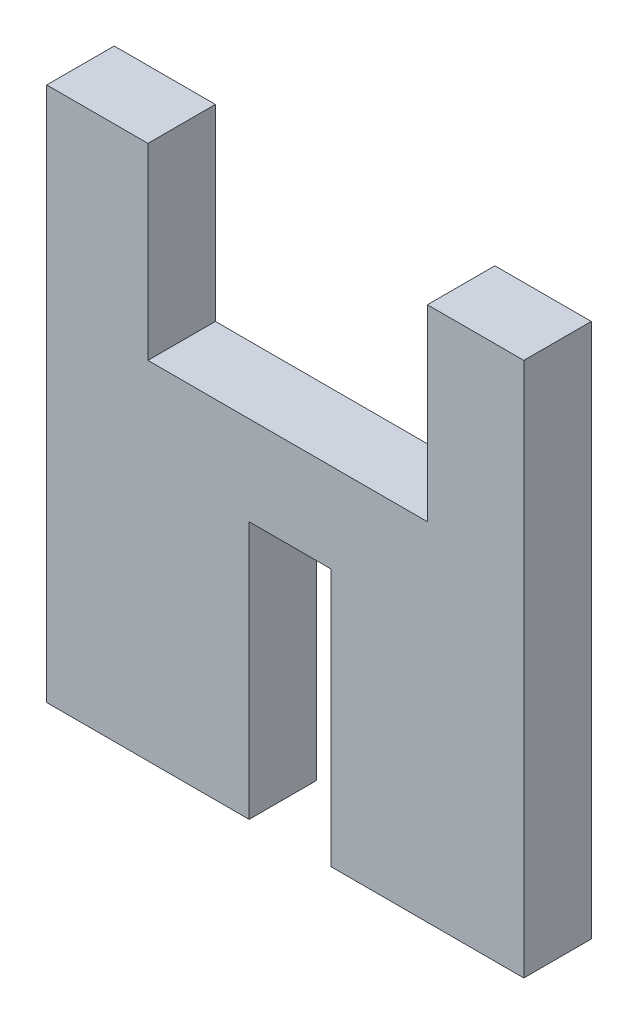
ISO-10303-21;
HEADER;
FILE_DESCRIPTION(('STEP AP214'),'2;1');
FILE_NAME('part.step','',(''),(''),'','','');
FILE_SCHEMA(('AUTOMOTIVE_DESIGN { 1 0 10303 214 1 1 1 1 }'));
ENDSEC;
DATA;
#1=APPLICATION_CONTEXT('core data for automotive mechanical design processes');
#2=APPLICATION_PROTOCOL_DEFINITION('international standard','automotive_design',2000,#1);
#3=PRODUCT_CONTEXT('',#1,'mechanical');
#4=PRODUCT('Part','Part','',(#3));
#5=PRODUCT_RELATED_PRODUCT_CATEGORY('part','',(#4));
#6=PRODUCT_DEFINITION_FORMATION('','',#4);
#7=PRODUCT_DEFINITION_CONTEXT('part definition',#1,'design');
#8=PRODUCT_DEFINITION('design','',#6,#7);
#9=PRODUCT_DEFINITION_SHAPE('','',#8);
#10=(LENGTH_UNIT() NAMED_UNIT(*) SI_UNIT(.MILLI.,.METRE.));
#11=(NAMED_UNIT(*) PLANE_ANGLE_UNIT() SI_UNIT($,.RADIAN.));
#12=(NAMED_UNIT(*) SI_UNIT($,.STERADIAN.) SOLID_ANGLE_UNIT());
#13=UNCERTAINTY_MEASURE_WITH_UNIT(LENGTH_MEASURE(1.E-05),#10,'distance_accuracy_value','');
#14=(GEOMETRIC_REPRESENTATION_CONTEXT(3) GLOBAL_UNCERTAINTY_ASSIGNED_CONTEXT((#13)) GLOBAL_UNIT_ASSIGNED_CONTEXT((#10,
#11,#12)) REPRESENTATION_CONTEXT('',''));
#15=CARTESIAN_POINT('',(0.,0.,0.));
#16=DIRECTION('',(0.,0.,1.));
#17=DIRECTION('',(1.,0.,0.));
#18=AXIS2_PLACEMENT_3D('',#15,#16,#17);
#19=CARTESIAN_POINT('',(-9.22857142857145,13.9642857142857,3.39999999999999));
#20=DIRECTION('',(0.,-1.,0.));
#21=DIRECTION('',(0.,0.,-1.));
#22=AXIS2_PLACEMENT_3D('',#19,#20,#21);
#23=PLANE('',#22);
#24=DIRECTION('',(-1.,0.,0.));
#25=VECTOR('',#24,1.);
#26=CARTESIAN_POINT('',(-9.22857142857145,13.9642857142857,0.));
#27=LINE('',#26,#25);
#28=CARTESIAN_POINT('',(-9.22857142857145,13.9642857142857,0.));
#29=VERTEX_POINT('',#28);
#30=CARTESIAN_POINT('',(-14.3285714285714,13.9642857142857,0.));
#31=VERTEX_POINT('',#30);
#32=EDGE_CURVE('E157',#29,#31,#27,.T.);
#33=ORIENTED_EDGE('',*,*,#32,.T.);
#34=DIRECTION('',(0.,0.,-1.));
#35=VECTOR('',#34,1.);
#36=CARTESIAN_POINT('',(-14.3285714285714,13.9642857142857,3.39999999999999));
#37=LINE('',#36,#35);
#38=CARTESIAN_POINT('',(-14.3285714285714,13.9642857142857,3.39999999999999));
#39=VERTEX_POINT('',#38);
#40=EDGE_CURVE('E11',#39,#31,#37,.T.);
#41=ORIENTED_EDGE('',*,*,#40,.F.);
#42=DIRECTION('',(-1.,0.,0.));
#43=VECTOR('',#42,1.);
#44=CARTESIAN_POINT('',(-9.22857142857145,13.9642857142857,3.39999999999999));
#45=LINE('',#44,#43);
#46=CARTESIAN_POINT('',(-9.22857142857145,13.9642857142857,3.39999999999999));
#47=VERTEX_POINT('',#46);
#48=EDGE_CURVE('E179',#47,#39,#45,.T.);
#49=ORIENTED_EDGE('',*,*,#48,.F.);
#50=DIRECTION('',(0.,0.,-1.));
#51=VECTOR('',#50,1.);
#52=CARTESIAN_POINT('',(-9.22857142857145,13.9642857142857,3.39999999999999));
#53=LINE('',#52,#51);
#54=EDGE_CURVE('E153',#47,#29,#53,.T.);
#55=ORIENTED_EDGE('',*,*,#54,.T.);
#56=EDGE_LOOP('',(#33,#41,#49,#55));
#57=FACE_BOUND('',#56,.T.);
#58=ADVANCED_FACE('F37',(#57),#23,.F.);
#59=CARTESIAN_POINT('',(-14.3285714285714,13.9642857142857,3.39999999999999));
#60=DIRECTION('',(1.,0.,0.));
#61=DIRECTION('',(0.,0.,-1.));
#62=AXIS2_PLACEMENT_3D('',#59,#60,#61);
#63=PLANE('',#62);
#64=DIRECTION('',(0.,-1.,0.));
#65=VECTOR('',#64,1.);
#66=CARTESIAN_POINT('',(-14.3285714285714,13.9642857142857,0.));
#67=LINE('',#66,#65);
#68=CARTESIAN_POINT('',(-14.3285714285714,-12.9928571428571,0.));
#69=VERTEX_POINT('',#68);
#70=EDGE_CURVE('E160',#31,#69,#67,.T.);
#71=ORIENTED_EDGE('',*,*,#70,.T.);
#72=DIRECTION('',(0.,0.,-1.));
#73=VECTOR('',#72,1.);
#74=CARTESIAN_POINT('',(-14.3285714285714,-12.9928571428571,3.39999999999999));
#75=LINE('',#74,#73);
#76=CARTESIAN_POINT('',(-14.3285714285714,-12.9928571428571,3.39999999999999));
#77=VERTEX_POINT('',#76);
#78=EDGE_CURVE('E45',#77,#69,#75,.T.);
#79=ORIENTED_EDGE('',*,*,#78,.F.);
#80=DIRECTION('',(0.,-1.,0.));
#81=VECTOR('',#80,1.);
#82=CARTESIAN_POINT('',(-14.3285714285714,13.9642857142857,3.39999999999999));
#83=LINE('',#82,#81);
#84=EDGE_CURVE('E108',#39,#77,#83,.T.);
#85=ORIENTED_EDGE('',*,*,#84,.F.);
#86=ORIENTED_EDGE('',*,*,#40,.T.);
#87=EDGE_LOOP('',(#71,#79,#85,#86));
#88=FACE_BOUND('',#87,.T.);
#89=ADVANCED_FACE('F257',(#88),#63,.F.);
#90=CARTESIAN_POINT('',(-14.3285714285714,-12.9928571428571,3.39999999999999));
#91=DIRECTION('',(0.,1.,0.));
#92=DIRECTION('',(0.,0.,1.));
#93=AXIS2_PLACEMENT_3D('',#90,#91,#92);
#94=PLANE('',#93);
#95=DIRECTION('',(1.,0.,0.));
#96=VECTOR('',#95,1.);
#97=CARTESIAN_POINT('',(-14.3285714285714,-12.9928571428571,0.));
#98=LINE('',#97,#96);
#99=CARTESIAN_POINT('',(-4.12857142857145,-12.9928571428571,0.));
#100=VERTEX_POINT('',#99);
#101=EDGE_CURVE('E162',#69,#100,#98,.T.);
#102=ORIENTED_EDGE('',*,*,#101,.T.);
#103=DIRECTION('',(0.,0.,-1.));
#104=VECTOR('',#103,1.);
#105=CARTESIAN_POINT('',(-4.12857142857145,-12.9928571428571,3.39999999999999));
#106=LINE('',#105,#104);
#107=CARTESIAN_POINT('',(-4.12857142857145,-12.9928571428571,3.39999999999999));
#108=VERTEX_POINT('',#107);
#109=EDGE_CURVE('E198',#108,#100,#106,.T.);
#110=ORIENTED_EDGE('',*,*,#109,.F.);
#111=DIRECTION('',(1.,0.,0.));
#112=VECTOR('',#111,1.);
#113=CARTESIAN_POINT('',(-14.3285714285714,-12.9928571428571,3.39999999999999));
#114=LINE('',#113,#112);
#115=EDGE_CURVE('E206',#77,#108,#114,.T.);
#116=ORIENTED_EDGE('',*,*,#115,.F.);
#117=ORIENTED_EDGE('',*,*,#78,.T.);
#118=EDGE_LOOP('',(#102,#110,#116,#117));
#119=FACE_BOUND('',#118,.T.);
#120=ADVANCED_FACE('F204',(#119),#94,.F.);
#121=CARTESIAN_POINT('',(-4.12857142857145,-12.9928571428571,3.39999999999999));
#122=DIRECTION('',(-1.,0.,0.));
#123=DIRECTION('',(0.,0.,1.));
#124=AXIS2_PLACEMENT_3D('',#121,#122,#123);
#125=PLANE('',#124);
#126=DIRECTION('',(0.,1.,0.));
#127=VECTOR('',#126,1.);
#128=CARTESIAN_POINT('',(-4.12857142857145,-12.9928571428571,0.));
#129=LINE('',#128,#127);
#130=CARTESIAN_POINT('',(-4.12857142857145,0.,0.));
#131=VERTEX_POINT('',#130);
#132=EDGE_CURVE('E164',#100,#131,#129,.T.);
#133=ORIENTED_EDGE('',*,*,#132,.T.);
#134=DIRECTION('',(0.,0.,-1.));
#135=VECTOR('',#134,1.);
#136=CARTESIAN_POINT('',(-4.12857142857145,0.,3.39999999999999));
#137=LINE('',#136,#135);
#138=CARTESIAN_POINT('',(-4.12857142857145,0.,3.39999999999999));
#139=VERTEX_POINT('',#138);
#140=EDGE_CURVE('E195',#139,#131,#137,.T.);
#141=ORIENTED_EDGE('',*,*,#140,.F.);
#142=DIRECTION('',(0.,1.,0.));
#143=VECTOR('',#142,1.);
#144=CARTESIAN_POINT('',(-4.12857142857145,-12.9928571428571,3.39999999999999));
#145=LINE('',#144,#143);
#146=EDGE_CURVE('E224',#108,#139,#145,.T.);
#147=ORIENTED_EDGE('',*,*,#146,.F.);
#148=ORIENTED_EDGE('',*,*,#109,.T.);
#149=EDGE_LOOP('',(#133,#141,#147,#148));
#150=FACE_BOUND('',#149,.T.);
#151=ADVANCED_FACE('F215',(#150),#125,.F.);
#152=CARTESIAN_POINT('',(-4.12857142857145,0.,3.39999999999999));
#153=DIRECTION('',(0.,1.,0.));
#154=DIRECTION('',(0.,0.,1.));
#155=AXIS2_PLACEMENT_3D('',#152,#153,#154);
#156=PLANE('',#155);
#157=DIRECTION('',(1.,0.,0.));
#158=VECTOR('',#157,1.);
#159=CARTESIAN_POINT('',(-4.12857142857145,0.,0.));
#160=LINE('',#159,#158);
#161=CARTESIAN_POINT('',(0.,0.,0.));
#162=VERTEX_POINT('',#161);
#163=EDGE_CURVE('E166',#131,#162,#160,.T.);
#164=ORIENTED_EDGE('',*,*,#163,.T.);
#165=DIRECTION('',(0.,0.,-1.));
#166=VECTOR('',#165,1.);
#167=CARTESIAN_POINT('',(0.,0.,3.39999999999999));
#168=LINE('',#167,#166);
#169=CARTESIAN_POINT('',(0.,0.,3.39999999999999));
#170=VERTEX_POINT('',#169);
#171=EDGE_CURVE('E192',#170,#162,#168,.T.);
#172=ORIENTED_EDGE('',*,*,#171,.F.);
#173=DIRECTION('',(1.,0.,0.));
#174=VECTOR('',#173,1.);
#175=CARTESIAN_POINT('',(-4.12857142857145,0.,3.39999999999999));
#176=LINE('',#175,#174);
#177=EDGE_CURVE('E221',#139,#170,#176,.T.);
#178=ORIENTED_EDGE('',*,*,#177,.F.);
#179=ORIENTED_EDGE('',*,*,#140,.T.);
#180=EDGE_LOOP('',(#164,#172,#178,#179));
#181=FACE_BOUND('',#180,.T.);
#182=ADVANCED_FACE('F219',(#181),#156,.F.);
#183=CARTESIAN_POINT('',(0.,0.,3.39999999999999));
#184=DIRECTION('',(1.,0.,0.));
#185=DIRECTION('',(0.,0.,-1.));
#186=AXIS2_PLACEMENT_3D('',#183,#184,#185);
#187=PLANE('',#186);
#188=DIRECTION('',(0.,-1.,0.));
#189=VECTOR('',#188,1.);
#190=CARTESIAN_POINT('',(0.,0.,0.));
#191=LINE('',#190,#189);
#192=CARTESIAN_POINT('',(0.,-12.9928571428571,0.));
#193=VERTEX_POINT('',#192);
#194=EDGE_CURVE('E168',#162,#193,#191,.T.);
#195=ORIENTED_EDGE('',*,*,#194,.T.);
#196=DIRECTION('',(0.,0.,-1.));
#197=VECTOR('',#196,1.);
#198=CARTESIAN_POINT('',(0.,-12.9928571428571,3.39999999999999));
#199=LINE('',#198,#197);
#200=CARTESIAN_POINT('',(0.,-12.9928571428571,3.39999999999999));
#201=VERTEX_POINT('',#200);
#202=EDGE_CURVE('E189',#201,#193,#199,.T.);
#203=ORIENTED_EDGE('',*,*,#202,.F.);
#204=DIRECTION('',(0.,-1.,0.));
#205=VECTOR('',#204,1.);
#206=CARTESIAN_POINT('',(0.,0.,3.39999999999999));
#207=LINE('',#206,#205);
#208=EDGE_CURVE('E223',#170,#201,#207,.T.);
#209=ORIENTED_EDGE('',*,*,#208,.F.);
#210=ORIENTED_EDGE('',*,*,#171,.T.);
#211=EDGE_LOOP('',(#195,#203,#209,#210));
#212=FACE_BOUND('',#211,.T.);
#213=ADVANCED_FACE('F270',(#212),#187,.F.);
#214=CARTESIAN_POINT('',(0.,-12.9928571428571,3.39999999999999));
#215=DIRECTION('',(0.,1.,0.));
#216=DIRECTION('',(0.,0.,1.));
#217=AXIS2_PLACEMENT_3D('',#214,#215,#216);
#218=PLANE('',#217);
#219=DIRECTION('',(1.,0.,0.));
#220=VECTOR('',#219,1.);
#221=CARTESIAN_POINT('',(0.,-12.9928571428571,0.));
#222=LINE('',#221,#220);
#223=CARTESIAN_POINT('',(9.7142857142857,-12.9928571428571,0.));
#224=VERTEX_POINT('',#223);
#225=EDGE_CURVE('E170',#193,#224,#222,.T.);
#226=ORIENTED_EDGE('',*,*,#225,.T.);
#227=DIRECTION('',(0.,0.,-1.));
#228=VECTOR('',#227,1.);
#229=CARTESIAN_POINT('',(9.7142857142857,-12.9928571428571,3.39999999999999));
#230=LINE('',#229,#228);
#231=CARTESIAN_POINT('',(9.7142857142857,-12.9928571428571,3.39999999999999));
#232=VERTEX_POINT('',#231);
#233=EDGE_CURVE('E186',#232,#224,#230,.T.);
#234=ORIENTED_EDGE('',*,*,#233,.F.);
#235=DIRECTION('',(1.,0.,0.));
#236=VECTOR('',#235,1.);
#237=CARTESIAN_POINT('',(0.,-12.9928571428571,3.39999999999999));
#238=LINE('',#237,#236);
#239=EDGE_CURVE('E226',#201,#232,#238,.T.);
#240=ORIENTED_EDGE('',*,*,#239,.F.);
#241=ORIENTED_EDGE('',*,*,#202,.T.);
#242=EDGE_LOOP('',(#226,#234,#240,#241));
#243=FACE_BOUND('',#242,.T.);
#244=ADVANCED_FACE('F273',(#243),#218,.F.);
#245=CARTESIAN_POINT('',(9.7142857142857,-12.9928571428571,3.39999999999999));
#246=DIRECTION('',(-1.,0.,0.));
#247=DIRECTION('',(0.,0.,1.));
#248=AXIS2_PLACEMENT_3D('',#245,#246,#247);
#249=PLANE('',#248);
#250=DIRECTION('',(0.,1.,0.));
#251=VECTOR('',#250,1.);
#252=CARTESIAN_POINT('',(9.7142857142857,-12.9928571428571,0.));
#253=LINE('',#252,#251);
#254=CARTESIAN_POINT('',(9.7142857142857,13.9642857142857,0.));
#255=VERTEX_POINT('',#254);
#256=EDGE_CURVE('E172',#224,#255,#253,.T.);
#257=ORIENTED_EDGE('',*,*,#256,.T.);
#258=DIRECTION('',(0.,0.,-1.));
#259=VECTOR('',#258,1.);
#260=CARTESIAN_POINT('',(9.7142857142857,13.9642857142857,3.39999999999999));
#261=LINE('',#260,#259);
#262=CARTESIAN_POINT('',(9.7142857142857,13.9642857142857,3.39999999999999));
#263=VERTEX_POINT('',#262);
#264=EDGE_CURVE('E183',#263,#255,#261,.T.);
#265=ORIENTED_EDGE('',*,*,#264,.F.);
#266=DIRECTION('',(0.,1.,0.));
#267=VECTOR('',#266,1.);
#268=CARTESIAN_POINT('',(9.7142857142857,-12.9928571428571,3.39999999999999));
#269=LINE('',#268,#267);
#270=EDGE_CURVE('E232',#232,#263,#269,.T.);
#271=ORIENTED_EDGE('',*,*,#270,.F.);
#272=ORIENTED_EDGE('',*,*,#233,.T.);
#273=EDGE_LOOP('',(#257,#265,#271,#272));
#274=FACE_BOUND('',#273,.T.);
#275=ADVANCED_FACE('F238',(#274),#249,.F.);
#276=CARTESIAN_POINT('',(9.7142857142857,13.9642857142857,3.39999999999999));
#277=DIRECTION('',(0.,-1.,0.));
#278=DIRECTION('',(0.,0.,-1.));
#279=AXIS2_PLACEMENT_3D('',#276,#277,#278);
#280=PLANE('',#279);
#281=DIRECTION('',(-1.,0.,0.));
#282=VECTOR('',#281,1.);
#283=CARTESIAN_POINT('',(9.7142857142857,13.9642857142857,0.));
#284=LINE('',#283,#282);
#285=CARTESIAN_POINT('',(4.85714285713357,13.9642857142857,0.));
#286=VERTEX_POINT('',#285);
#287=EDGE_CURVE('E174',#255,#286,#284,.T.);
#288=ORIENTED_EDGE('',*,*,#287,.T.);
#289=DIRECTION('',(0.,0.,-1.));
#290=VECTOR('',#289,1.);
#291=CARTESIAN_POINT('',(4.85714285713357,13.9642857142857,3.39999999999999));
#292=LINE('',#291,#290);
#293=CARTESIAN_POINT('',(4.85714285713357,13.9642857142857,3.39999999999999));
#294=VERTEX_POINT('',#293);
#295=EDGE_CURVE('E148',#294,#286,#292,.T.);
#296=ORIENTED_EDGE('',*,*,#295,.F.);
#297=DIRECTION('',(-1.,0.,0.));
#298=VECTOR('',#297,1.);
#299=CARTESIAN_POINT('',(9.7142857142857,13.9642857142857,3.39999999999999));
#300=LINE('',#299,#298);
#301=EDGE_CURVE('E139',#263,#294,#300,.T.);
#302=ORIENTED_EDGE('',*,*,#301,.F.);
#303=ORIENTED_EDGE('',*,*,#264,.T.);
#304=EDGE_LOOP('',(#288,#296,#302,#303));
#305=FACE_BOUND('',#304,.T.);
#306=ADVANCED_FACE('F242',(#305),#280,.F.);
#307=CARTESIAN_POINT('',(4.85714285713357,13.9642857142857,3.39999999999999));
#308=DIRECTION('',(1.,0.,0.));
#309=DIRECTION('',(0.,1.,0.));
#310=AXIS2_PLACEMENT_3D('',#307,#308,#309);
#311=PLANE('',#310);
#312=DIRECTION('',(0.,-1.,0.));
#313=VECTOR('',#312,1.);
#314=CARTESIAN_POINT('',(4.85714285713357,13.9642857142857,0.));
#315=LINE('',#314,#313);
#316=CARTESIAN_POINT('',(4.85714285713357,4.49285714285715,0.));
#317=VERTEX_POINT('',#316);
#318=EDGE_CURVE('E147',#286,#317,#315,.T.);
#319=ORIENTED_EDGE('',*,*,#318,.T.);
#320=DIRECTION('',(0.,0.,-1.));
#321=VECTOR('',#320,1.);
#322=CARTESIAN_POINT('',(4.85714285713357,4.49285714285715,3.39999999999999));
#323=LINE('',#322,#321);
#324=CARTESIAN_POINT('',(4.85714285713357,4.49285714285715,3.39999999999999));
#325=VERTEX_POINT('',#324);
#326=EDGE_CURVE('E144',#325,#317,#323,.T.);
#327=ORIENTED_EDGE('',*,*,#326,.F.);
#328=DIRECTION('',(0.,-1.,0.));
#329=VECTOR('',#328,1.);
#330=CARTESIAN_POINT('',(4.85714285713357,13.9642857142857,3.39999999999999));
#331=LINE('',#330,#329);
#332=EDGE_CURVE('E133',#294,#325,#331,.T.);
#333=ORIENTED_EDGE('',*,*,#332,.F.);
#334=ORIENTED_EDGE('',*,*,#295,.T.);
#335=EDGE_LOOP('',(#319,#327,#333,#334));
#336=FACE_BOUND('',#335,.T.);
#337=ADVANCED_FACE('F145',(#336),#311,.F.);
#338=CARTESIAN_POINT('',(4.85714285713357,4.49285714285715,3.39999999999999));
#339=DIRECTION('',(0.,-1.,0.));
#340=DIRECTION('',(0.,0.,-1.));
#341=AXIS2_PLACEMENT_3D('',#338,#339,#340);
#342=PLANE('',#341);
#343=DIRECTION('',(-1.,0.,0.));
#344=VECTOR('',#343,1.);
#345=CARTESIAN_POINT('',(4.85714285713357,4.49285714285715,0.));
#346=LINE('',#345,#344);
#347=CARTESIAN_POINT('',(-9.22857142857145,4.49285714285715,0.));
#348=VERTEX_POINT('',#347);
#349=EDGE_CURVE('E94',#317,#348,#346,.T.);
#350=ORIENTED_EDGE('',*,*,#349,.T.);
#351=DIRECTION('',(0.,0.,-1.));
#352=VECTOR('',#351,1.);
#353=CARTESIAN_POINT('',(-9.22857142857145,4.49285714285715,3.39999999999999));
#354=LINE('',#353,#352);
#355=CARTESIAN_POINT('',(-9.22857142857145,4.49285714285715,3.39999999999999));
#356=VERTEX_POINT('',#355);
#357=EDGE_CURVE('E149',#356,#348,#354,.T.);
#358=ORIENTED_EDGE('',*,*,#357,.F.);
#359=DIRECTION('',(-1.,0.,0.));
#360=VECTOR('',#359,1.);
#361=CARTESIAN_POINT('',(4.85714285713357,4.49285714285715,3.39999999999999));
#362=LINE('',#361,#360);
#363=EDGE_CURVE('E137',#325,#356,#362,.T.);
#364=ORIENTED_EDGE('',*,*,#363,.F.);
#365=ORIENTED_EDGE('',*,*,#326,.T.);
#366=EDGE_LOOP('',(#350,#358,#364,#365));
#367=FACE_BOUND('',#366,.T.);
#368=ADVANCED_FACE('F151',(#367),#342,.F.);
#369=CARTESIAN_POINT('',(-9.22857142857145,4.49285714285715,3.39999999999999));
#370=DIRECTION('',(-1.,0.,0.));
#371=DIRECTION('',(0.,0.,1.));
#372=AXIS2_PLACEMENT_3D('',#369,#370,#371);
#373=PLANE('',#372);
#374=DIRECTION('',(0.,1.,0.));
#375=VECTOR('',#374,1.);
#376=CARTESIAN_POINT('',(-9.22857142857145,4.49285714285715,0.));
#377=LINE('',#376,#375);
#378=EDGE_CURVE('E100',#348,#29,#377,.T.);
#379=ORIENTED_EDGE('',*,*,#378,.T.);
#380=ORIENTED_EDGE('',*,*,#54,.F.);
#381=DIRECTION('',(0.,1.,0.));
#382=VECTOR('',#381,1.);
#383=CARTESIAN_POINT('',(-9.22857142857145,4.49285714285715,3.39999999999999));
#384=LINE('',#383,#382);
#385=EDGE_CURVE('E53',#356,#47,#384,.T.);
#386=ORIENTED_EDGE('',*,*,#385,.F.);
#387=ORIENTED_EDGE('',*,*,#357,.T.);
#388=EDGE_LOOP('',(#379,#380,#386,#387));
#389=FACE_BOUND('',#388,.T.);
#390=ADVANCED_FACE('F246',(#389),#373,.F.);
#391=CARTESIAN_POINT('',(0.,0.,3.39999999999999));
#392=DIRECTION('',(0.,0.,1.));
#393=DIRECTION('',(1.,0.,0.));
#394=AXIS2_PLACEMENT_3D('',#391,#392,#393);
#395=PLANE('',#394);
#396=ORIENTED_EDGE('',*,*,#48,.T.);
#397=ORIENTED_EDGE('',*,*,#84,.T.);
#398=ORIENTED_EDGE('',*,*,#115,.T.);
#399=ORIENTED_EDGE('',*,*,#146,.T.);
#400=ORIENTED_EDGE('',*,*,#177,.T.);
#401=ORIENTED_EDGE('',*,*,#208,.T.);
#402=ORIENTED_EDGE('',*,*,#239,.T.);
#403=ORIENTED_EDGE('',*,*,#270,.T.);
#404=ORIENTED_EDGE('',*,*,#301,.T.);
#405=ORIENTED_EDGE('',*,*,#332,.T.);
#406=ORIENTED_EDGE('',*,*,#363,.T.);
#407=ORIENTED_EDGE('',*,*,#385,.T.);
#408=EDGE_LOOP('',(#396,#397,#398,#399,#400,#401,#402,#403,#404,#405,#406,#407));
#409=FACE_BOUND('',#408,.T.);
#410=ADVANCED_FACE('F135',(#409),#395,.T.);
#411=CARTESIAN_POINT('',(0.,0.,0.));
#412=DIRECTION('',(0.,0.,1.));
#413=DIRECTION('',(1.,0.,0.));
#414=AXIS2_PLACEMENT_3D('',#411,#412,#413);
#415=PLANE('',#414);
#416=ORIENTED_EDGE('',*,*,#32,.F.);
#417=ORIENTED_EDGE('',*,*,#378,.F.);
#418=ORIENTED_EDGE('',*,*,#349,.F.);
#419=ORIENTED_EDGE('',*,*,#318,.F.);
#420=ORIENTED_EDGE('',*,*,#287,.F.);
#421=ORIENTED_EDGE('',*,*,#256,.F.);
#422=ORIENTED_EDGE('',*,*,#225,.F.);
#423=ORIENTED_EDGE('',*,*,#194,.F.);
#424=ORIENTED_EDGE('',*,*,#163,.F.);
#425=ORIENTED_EDGE('',*,*,#132,.F.);
#426=ORIENTED_EDGE('',*,*,#101,.F.);
#427=ORIENTED_EDGE('',*,*,#70,.F.);
#428=EDGE_LOOP('',(#416,#417,#418,#419,#420,#421,#422,#423,#424,#425,#426,#427));
#429=FACE_BOUND('',#428,.T.);
#430=ADVANCED_FACE('F210',(#429),#415,.F.);
#431=CLOSED_SHELL('',(#58,#89,#120,#151,#182,#213,#244,#275,#306,#337,#368,#390,#410,#430));
#432=MANIFOLD_SOLID_BREP('B2',#431);
#433=ADVANCED_BREP_SHAPE_REPRESENTATION('',(#18,#432),#14);
#434=SHAPE_DEFINITION_REPRESENTATION(#9,#433);
ENDSEC;
END-ISO-10303-21;
